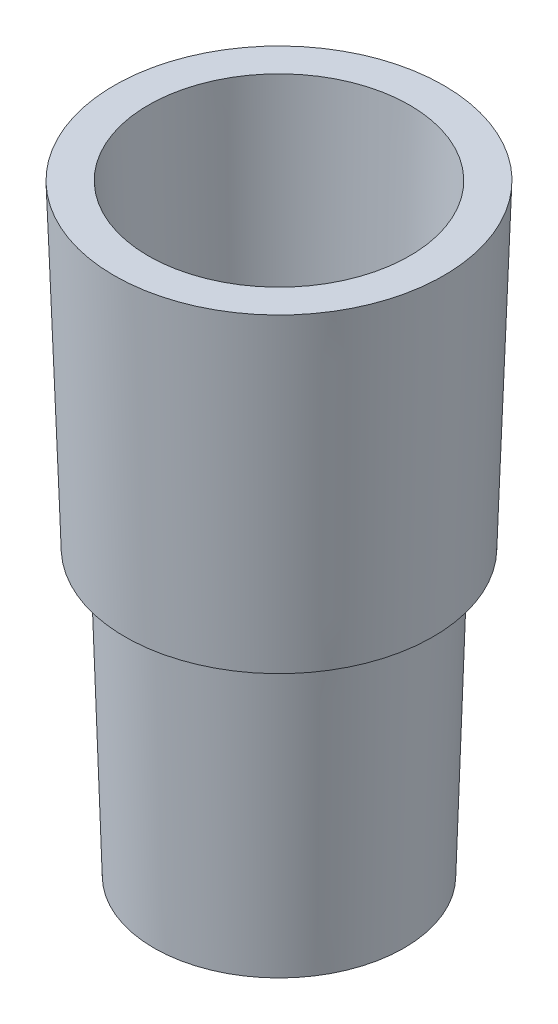
ISO-10303-21;
HEADER;
FILE_DESCRIPTION(('STEP AP214'),'2;1');
FILE_NAME('part.step','',(''),(''),'','','');
FILE_SCHEMA(('AUTOMOTIVE_DESIGN { 1 0 10303 214 1 1 1 1 }'));
ENDSEC;
DATA;
#1=APPLICATION_CONTEXT('core data for automotive mechanical design processes');
#2=APPLICATION_PROTOCOL_DEFINITION('international standard','automotive_design',2000,#1);
#3=PRODUCT_CONTEXT('',#1,'mechanical');
#4=PRODUCT('Part','Part','',(#3));
#5=PRODUCT_RELATED_PRODUCT_CATEGORY('part','',(#4));
#6=PRODUCT_DEFINITION_FORMATION('','',#4);
#7=PRODUCT_DEFINITION_CONTEXT('part definition',#1,'design');
#8=PRODUCT_DEFINITION('design','',#6,#7);
#9=PRODUCT_DEFINITION_SHAPE('','',#8);
#10=(LENGTH_UNIT() NAMED_UNIT(*) SI_UNIT(.MILLI.,.METRE.));
#11=(NAMED_UNIT(*) PLANE_ANGLE_UNIT() SI_UNIT($,.RADIAN.));
#12=(NAMED_UNIT(*) SI_UNIT($,.STERADIAN.) SOLID_ANGLE_UNIT());
#13=UNCERTAINTY_MEASURE_WITH_UNIT(LENGTH_MEASURE(1.E-05),#10,'distance_accuracy_value','');
#14=(GEOMETRIC_REPRESENTATION_CONTEXT(3) GLOBAL_UNCERTAINTY_ASSIGNED_CONTEXT((#13)) GLOBAL_UNIT_ASSIGNED_CONTEXT((#10,
#11,#12)) REPRESENTATION_CONTEXT('',''));
#15=CARTESIAN_POINT('',(0.,0.,0.));
#16=DIRECTION('',(0.,0.,1.));
#17=DIRECTION('',(1.,0.,0.));
#18=AXIS2_PLACEMENT_3D('',#15,#16,#17);
#19=CARTESIAN_POINT('',(11.,0.,0.));
#20=DIRECTION('',(0.,-1.,0.));
#21=DIRECTION('',(0.,0.,-1.));
#22=AXIS2_PLACEMENT_3D('',#19,#20,#21);
#23=PLANE('',#22);
#24=CARTESIAN_POINT('',(0.,0.,0.));
#25=DIRECTION('',(0.,-1.,0.));
#26=DIRECTION('',(0.,0.,-1.));
#27=AXIS2_PLACEMENT_3D('',#24,#25,#26);
#28=CIRCLE('',#27,11.);
#29=CARTESIAN_POINT('',(0.,0.,-11.));
#30=VERTEX_POINT('',#29);
#31=EDGE_CURVE('E59',#30,#30,#28,.T.);
#32=ORIENTED_EDGE('',*,*,#31,.T.);
#33=EDGE_LOOP('',(#32));
#34=FACE_BOUND('',#33,.T.);
#35=CARTESIAN_POINT('',(0.,0.,0.));
#36=DIRECTION('',(0.,-1.,0.));
#37=DIRECTION('',(0.,0.,-1.));
#38=AXIS2_PLACEMENT_3D('',#35,#36,#37);
#39=CIRCLE('',#38,8.);
#40=CARTESIAN_POINT('',(0.,0.,-8.));
#41=VERTEX_POINT('',#40);
#42=EDGE_CURVE('E10',#41,#41,#39,.T.);
#43=ORIENTED_EDGE('',*,*,#42,.F.);
#44=EDGE_LOOP('',(#43));
#45=FACE_BOUND('',#44,.T.);
#46=ADVANCED_FACE('F31',(#34,#45),#23,.T.);
#47=CARTESIAN_POINT('',(0.,0.,0.));
#48=DIRECTION('',(0.,-1.,0.));
#49=DIRECTION('',(0.,0.,-1.));
#50=AXIS2_PLACEMENT_3D('',#47,#48,#49);
#51=CYLINDRICAL_SURFACE('',#50,8.);
#52=ORIENTED_EDGE('',*,*,#42,.T.);
#53=EDGE_LOOP('',(#52));
#54=FACE_BOUND('',#53,.T.);
#55=CARTESIAN_POINT('',(0.,28.,0.));
#56=DIRECTION('',(0.,-1.,0.));
#57=DIRECTION('',(0.,0.,-1.));
#58=AXIS2_PLACEMENT_3D('',#55,#56,#57);
#59=CIRCLE('',#58,8.);
#60=CARTESIAN_POINT('',(0.,28.,-8.));
#61=VERTEX_POINT('',#60);
#62=EDGE_CURVE('E37',#61,#61,#59,.T.);
#63=ORIENTED_EDGE('',*,*,#62,.F.);
#64=EDGE_LOOP('',(#63));
#65=FACE_BOUND('',#64,.T.);
#66=ADVANCED_FACE('F77',(#54,#65),#51,.F.);
#67=CARTESIAN_POINT('',(0.,30.75,0.));
#68=DIRECTION('',(0.,1.,0.));
#69=DIRECTION('',(0.,0.,1.));
#70=AXIS2_PLACEMENT_3D('',#67,#68,#69);
#71=CONICAL_SURFACE('',#70,10.75,0.78539816339745);
#72=ORIENTED_EDGE('',*,*,#62,.T.);
#73=EDGE_LOOP('',(#72));
#74=FACE_BOUND('',#73,.T.);
#75=CARTESIAN_POINT('',(0.,30.75,0.));
#76=DIRECTION('',(0.,-1.,0.));
#77=DIRECTION('',(0.,0.,-1.));
#78=AXIS2_PLACEMENT_3D('',#75,#76,#77);
#79=CIRCLE('',#78,10.75);
#80=CARTESIAN_POINT('',(0.,30.75,-10.75));
#81=VERTEX_POINT('',#80);
#82=EDGE_CURVE('E41',#81,#81,#79,.T.);
#83=ORIENTED_EDGE('',*,*,#82,.F.);
#84=EDGE_LOOP('',(#83));
#85=FACE_BOUND('',#84,.T.);
#86=ADVANCED_FACE('F81',(#74,#85),#71,.F.);
#87=CARTESIAN_POINT('',(0.,53.,0.));
#88=DIRECTION('',(0.,1.,0.));
#89=DIRECTION('',(0.,0.,1.));
#90=AXIS2_PLACEMENT_3D('',#87,#88,#89);
#91=CONICAL_SURFACE('',#90,11.5,0.0336951073460163);
#92=ORIENTED_EDGE('',*,*,#82,.T.);
#93=EDGE_LOOP('',(#92));
#94=FACE_BOUND('',#93,.T.);
#95=CARTESIAN_POINT('',(0.,53.,0.));
#96=DIRECTION('',(0.,-1.,0.));
#97=DIRECTION('',(0.,0.,-1.));
#98=AXIS2_PLACEMENT_3D('',#95,#96,#97);
#99=CIRCLE('',#98,11.5);
#100=CARTESIAN_POINT('',(0.,53.,-11.5));
#101=VERTEX_POINT('',#100);
#102=EDGE_CURVE('E45',#101,#101,#99,.T.);
#103=ORIENTED_EDGE('',*,*,#102,.F.);
#104=EDGE_LOOP('',(#103));
#105=FACE_BOUND('',#104,.T.);
#106=ADVANCED_FACE('F85',(#94,#105),#91,.F.);
#107=CARTESIAN_POINT('',(11.5,53.,0.));
#108=DIRECTION('',(0.,1.,0.));
#109=DIRECTION('',(0.,0.,1.));
#110=AXIS2_PLACEMENT_3D('',#107,#108,#109);
#111=PLANE('',#110);
#112=ORIENTED_EDGE('',*,*,#102,.T.);
#113=EDGE_LOOP('',(#112));
#114=FACE_BOUND('',#113,.T.);
#115=CARTESIAN_POINT('',(0.,53.,0.));
#116=DIRECTION('',(0.,-1.,0.));
#117=DIRECTION('',(0.,0.,-1.));
#118=AXIS2_PLACEMENT_3D('',#115,#116,#117);
#119=CIRCLE('',#118,14.5);
#120=CARTESIAN_POINT('',(0.,53.,-14.5));
#121=VERTEX_POINT('',#120);
#122=EDGE_CURVE('E50',#121,#121,#119,.T.);
#123=ORIENTED_EDGE('',*,*,#122,.F.);
#124=EDGE_LOOP('',(#123));
#125=FACE_BOUND('',#124,.T.);
#126=ADVANCED_FACE('F91',(#114,#125),#111,.T.);
#127=CARTESIAN_POINT('',(0.,25.,0.));
#128=DIRECTION('',(0.,1.,0.));
#129=DIRECTION('',(0.,0.,1.));
#130=AXIS2_PLACEMENT_3D('',#127,#128,#129);
#131=CONICAL_SURFACE('',#130,13.5561797752809,0.0336951073460162);
#132=ORIENTED_EDGE('',*,*,#122,.T.);
#133=EDGE_LOOP('',(#132));
#134=FACE_BOUND('',#133,.T.);
#135=CARTESIAN_POINT('',(0.,25.,0.));
#136=DIRECTION('',(0.,-1.,0.));
#137=DIRECTION('',(0.,0.,-1.));
#138=AXIS2_PLACEMENT_3D('',#135,#136,#137);
#139=CIRCLE('',#138,13.5561797752809);
#140=CARTESIAN_POINT('',(0.,25.,-13.5561797752809));
#141=VERTEX_POINT('',#140);
#142=EDGE_CURVE('E53',#141,#141,#139,.T.);
#143=ORIENTED_EDGE('',*,*,#142,.F.);
#144=EDGE_LOOP('',(#143));
#145=FACE_BOUND('',#144,.T.);
#146=ADVANCED_FACE('F73',(#134,#145),#131,.T.);
#147=CARTESIAN_POINT('',(13.5561797752809,25.,0.));
#148=DIRECTION('',(0.,-1.,0.));
#149=DIRECTION('',(0.,0.,-1.));
#150=AXIS2_PLACEMENT_3D('',#147,#148,#149);
#151=PLANE('',#150);
#152=ORIENTED_EDGE('',*,*,#142,.T.);
#153=EDGE_LOOP('',(#152));
#154=FACE_BOUND('',#153,.T.);
#155=CARTESIAN_POINT('',(0.,25.,0.));
#156=DIRECTION('',(0.,-1.,0.));
#157=DIRECTION('',(0.,0.,-1.));
#158=AXIS2_PLACEMENT_3D('',#155,#156,#157);
#159=CIRCLE('',#158,11.75);
#160=CARTESIAN_POINT('',(0.,25.,-11.75));
#161=VERTEX_POINT('',#160);
#162=EDGE_CURVE('E56',#161,#161,#159,.T.);
#163=ORIENTED_EDGE('',*,*,#162,.F.);
#164=EDGE_LOOP('',(#163));
#165=FACE_BOUND('',#164,.T.);
#166=ADVANCED_FACE('F67',(#154,#165),#151,.T.);
#167=CARTESIAN_POINT('',(0.,0.,0.));
#168=DIRECTION('',(0.,1.,0.));
#169=DIRECTION('',(0.,0.,1.));
#170=AXIS2_PLACEMENT_3D('',#167,#168,#169);
#171=CONICAL_SURFACE('',#170,11.,0.0299910048568779);
#172=ORIENTED_EDGE('',*,*,#162,.T.);
#173=EDGE_LOOP('',(#172));
#174=FACE_BOUND('',#173,.T.);
#175=ORIENTED_EDGE('',*,*,#31,.F.);
#176=EDGE_LOOP('',(#175));
#177=FACE_BOUND('',#176,.T.);
#178=ADVANCED_FACE('F65',(#174,#177),#171,.T.);
#179=CLOSED_SHELL('',(#46,#66,#86,#106,#126,#146,#166,#178));
#180=MANIFOLD_SOLID_BREP('B2',#179);
#181=ADVANCED_BREP_SHAPE_REPRESENTATION('',(#18,#180),#14);
#182=SHAPE_DEFINITION_REPRESENTATION(#9,#181);
ENDSEC;
END-ISO-10303-21;
